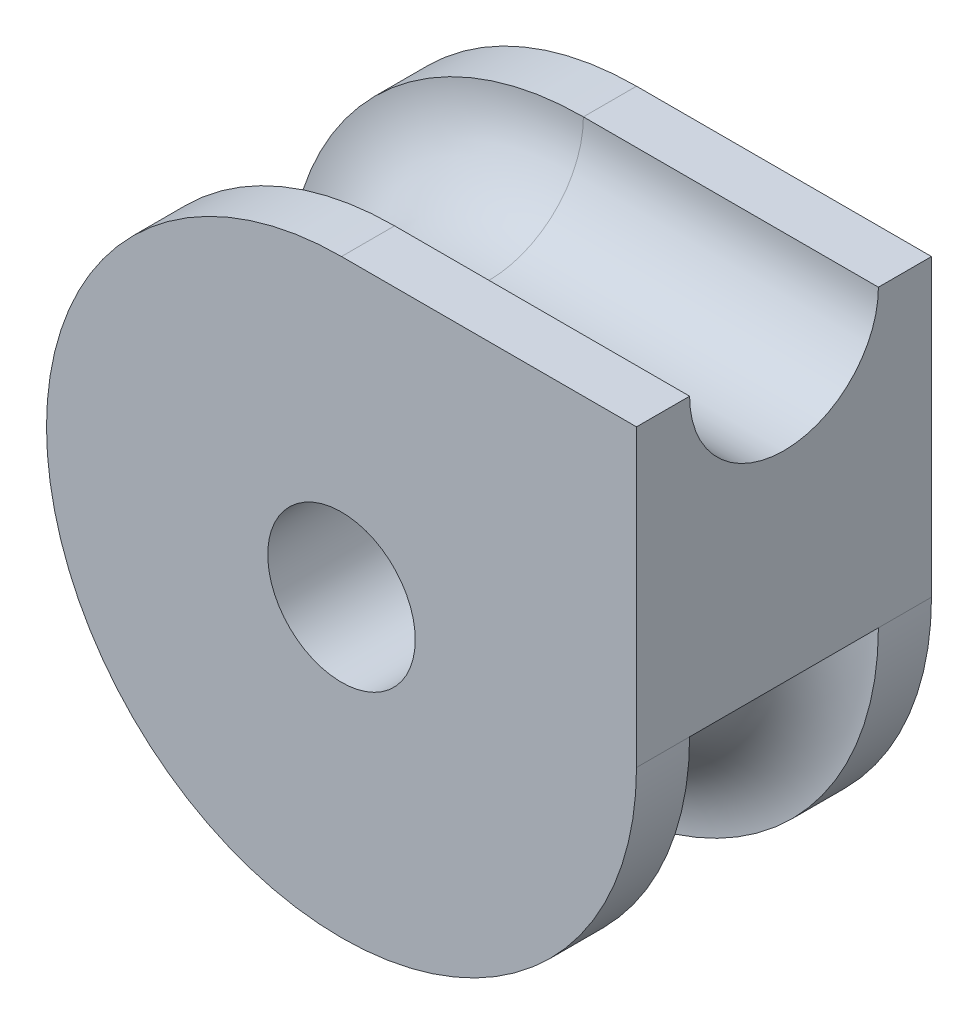
ISO-10303-21;
HEADER;
FILE_DESCRIPTION(('STEP AP214'),'2;1');
FILE_NAME('part.step','',(''),(''),'','','');
FILE_SCHEMA(('AUTOMOTIVE_DESIGN { 1 0 10303 214 1 1 1 1 }'));
ENDSEC;
DATA;
#1=APPLICATION_CONTEXT('core data for automotive mechanical design processes');
#2=APPLICATION_PROTOCOL_DEFINITION('international standard','automotive_design',2000,#1);
#3=PRODUCT_CONTEXT('',#1,'mechanical');
#4=PRODUCT('Part','Part','',(#3));
#5=PRODUCT_RELATED_PRODUCT_CATEGORY('part','',(#4));
#6=PRODUCT_DEFINITION_FORMATION('','',#4);
#7=PRODUCT_DEFINITION_CONTEXT('part definition',#1,'design');
#8=PRODUCT_DEFINITION('design','',#6,#7);
#9=PRODUCT_DEFINITION_SHAPE('','',#8);
#10=(LENGTH_UNIT() NAMED_UNIT(*) SI_UNIT(.MILLI.,.METRE.));
#11=(NAMED_UNIT(*) PLANE_ANGLE_UNIT() SI_UNIT($,.RADIAN.));
#12=(NAMED_UNIT(*) SI_UNIT($,.STERADIAN.) SOLID_ANGLE_UNIT());
#13=UNCERTAINTY_MEASURE_WITH_UNIT(LENGTH_MEASURE(1.E-05),#10,'distance_accuracy_value','');
#14=(GEOMETRIC_REPRESENTATION_CONTEXT(3) GLOBAL_UNCERTAINTY_ASSIGNED_CONTEXT((#13)) GLOBAL_UNIT_ASSIGNED_CONTEXT((#10,
#11,#12)) REPRESENTATION_CONTEXT('',''));
#15=CARTESIAN_POINT('',(0.,0.,0.));
#16=DIRECTION('',(0.,0.,1.));
#17=DIRECTION('',(1.,0.,0.));
#18=AXIS2_PLACEMENT_3D('',#15,#16,#17);
#19=CARTESIAN_POINT('',(0.,50.,50.));
#20=DIRECTION('',(0.,-1.,0.));
#21=DIRECTION('',(0.,0.,-1.));
#22=AXIS2_PLACEMENT_3D('',#19,#20,#21);
#23=PLANE('',#22);
#24=DIRECTION('',(-1.,0.,0.));
#25=VECTOR('',#24,1.);
#26=CARTESIAN_POINT('',(50.,50.,9.));
#27=LINE('',#26,#25);
#28=CARTESIAN_POINT('',(50.,50.,9.));
#29=VERTEX_POINT('',#28);
#30=CARTESIAN_POINT('',(0.,50.,9.));
#31=VERTEX_POINT('',#30);
#32=EDGE_CURVE('E111',#29,#31,#27,.T.);
#33=ORIENTED_EDGE('',*,*,#32,.F.);
#34=DIRECTION('',(0.,0.,-1.));
#35=VECTOR('',#34,1.);
#36=CARTESIAN_POINT('',(50.,50.,50.));
#37=LINE('',#36,#35);
#38=CARTESIAN_POINT('',(50.,50.,0.));
#39=VERTEX_POINT('',#38);
#40=EDGE_CURVE('E118',#29,#39,#37,.T.);
#41=ORIENTED_EDGE('',*,*,#40,.T.);
#42=DIRECTION('',(-1.,0.,0.));
#43=VECTOR('',#42,1.);
#44=CARTESIAN_POINT('',(0.,50.,0.));
#45=LINE('',#44,#43);
#46=CARTESIAN_POINT('',(0.,50.,0.));
#47=VERTEX_POINT('',#46);
#48=EDGE_CURVE('E135',#39,#47,#45,.T.);
#49=ORIENTED_EDGE('',*,*,#48,.T.);
#50=DIRECTION('',(0.,0.,-1.));
#51=VECTOR('',#50,1.);
#52=CARTESIAN_POINT('',(0.,50.,50.));
#53=LINE('',#52,#51);
#54=EDGE_CURVE('E87',#31,#47,#53,.T.);
#55=ORIENTED_EDGE('',*,*,#54,.F.);
#56=EDGE_LOOP('',(#33,#41,#49,#55));
#57=FACE_BOUND('',#56,.T.);
#58=ADVANCED_FACE('F42',(#57),#23,.F.);
#59=CARTESIAN_POINT('',(0.,0.,50.));
#60=DIRECTION('',(0.,0.,-1.));
#61=DIRECTION('',(-1.,0.,0.));
#62=AXIS2_PLACEMENT_3D('',#59,#60,#61);
#63=CYLINDRICAL_SURFACE('',#62,50.);
#64=DIRECTION('',(0.,0.,-1.));
#65=VECTOR('',#64,1.);
#66=CARTESIAN_POINT('',(50.,0.,50.));
#67=LINE('',#66,#65);
#68=CARTESIAN_POINT('',(50.,5.2372220082647E-13,9.));
#69=VERTEX_POINT('',#68);
#70=CARTESIAN_POINT('',(50.,0.,0.));
#71=VERTEX_POINT('',#70);
#72=EDGE_CURVE('E52',#69,#71,#67,.T.);
#73=ORIENTED_EDGE('',*,*,#72,.F.);
#74=CARTESIAN_POINT('',(0.,0.,9.));
#75=DIRECTION('',(0.,0.,-1.));
#76=DIRECTION('',(-1.,0.,0.));
#77=AXIS2_PLACEMENT_3D('',#74,#75,#76);
#78=CIRCLE('',#77,50.);
#79=EDGE_CURVE('E153',#69,#31,#78,.T.);
#80=ORIENTED_EDGE('',*,*,#79,.T.);
#81=ORIENTED_EDGE('',*,*,#54,.T.);
#82=CARTESIAN_POINT('',(0.,0.,0.));
#83=DIRECTION('',(0.,0.,1.));
#84=DIRECTION('',(1.,0.,0.));
#85=AXIS2_PLACEMENT_3D('',#82,#83,#84);
#86=CIRCLE('',#85,50.);
#87=EDGE_CURVE('E138',#47,#71,#86,.T.);
#88=ORIENTED_EDGE('',*,*,#87,.T.);
#89=EDGE_LOOP('',(#73,#80,#81,#88));
#90=FACE_BOUND('',#89,.T.);
#91=ADVANCED_FACE('F177',(#90),#63,.T.);
#92=CARTESIAN_POINT('',(0.,0.,50.));
#93=DIRECTION('',(0.,0.,1.));
#94=DIRECTION('',(1.,0.,0.));
#95=AXIS2_PLACEMENT_3D('',#92,#93,#94);
#96=PLANE('',#95);
#97=CARTESIAN_POINT('',(0.,0.,50.));
#98=DIRECTION('',(0.,0.,1.));
#99=DIRECTION('',(1.,0.,0.));
#100=AXIS2_PLACEMENT_3D('',#97,#98,#99);
#101=CIRCLE('',#100,50.);
#102=CARTESIAN_POINT('',(0.,50.,50.));
#103=VERTEX_POINT('',#102);
#104=CARTESIAN_POINT('',(50.,0.,50.));
#105=VERTEX_POINT('',#104);
#106=EDGE_CURVE('E133',#103,#105,#101,.T.);
#107=ORIENTED_EDGE('',*,*,#106,.T.);
#108=DIRECTION('',(0.,1.,0.));
#109=VECTOR('',#108,1.);
#110=CARTESIAN_POINT('',(50.,50.,50.));
#111=LINE('',#110,#109);
#112=CARTESIAN_POINT('',(50.,50.,50.));
#113=VERTEX_POINT('',#112);
#114=EDGE_CURVE('E95',#105,#113,#111,.T.);
#115=ORIENTED_EDGE('',*,*,#114,.T.);
#116=DIRECTION('',(-1.,0.,0.));
#117=VECTOR('',#116,1.);
#118=CARTESIAN_POINT('',(0.,50.,50.));
#119=LINE('',#118,#117);
#120=EDGE_CURVE('E68',#113,#103,#119,.T.);
#121=ORIENTED_EDGE('',*,*,#120,.T.);
#122=EDGE_LOOP('',(#107,#115,#121));
#123=FACE_BOUND('',#122,.T.);
#124=CARTESIAN_POINT('',(0.,0.,50.));
#125=DIRECTION('',(0.,0.,1.));
#126=DIRECTION('',(1.,0.,0.));
#127=AXIS2_PLACEMENT_3D('',#124,#125,#126);
#128=CIRCLE('',#127,12.5);
#129=CARTESIAN_POINT('',(12.5,0.,50.));
#130=VERTEX_POINT('',#129);
#131=EDGE_CURVE('E142',#130,#130,#128,.T.);
#132=ORIENTED_EDGE('',*,*,#131,.F.);
#133=EDGE_LOOP('',(#132));
#134=FACE_BOUND('',#133,.T.);
#135=ADVANCED_FACE('F195',(#123,#134),#96,.T.);
#136=CARTESIAN_POINT('',(0.,0.,0.));
#137=DIRECTION('',(0.,0.,1.));
#138=DIRECTION('',(1.,0.,0.));
#139=AXIS2_PLACEMENT_3D('',#136,#137,#138);
#140=PLANE('',#139);
#141=ORIENTED_EDGE('',*,*,#87,.F.);
#142=ORIENTED_EDGE('',*,*,#48,.F.);
#143=DIRECTION('',(0.,1.,0.));
#144=VECTOR('',#143,1.);
#145=CARTESIAN_POINT('',(50.,50.,0.));
#146=LINE('',#145,#144);
#147=EDGE_CURVE('E136',#71,#39,#146,.T.);
#148=ORIENTED_EDGE('',*,*,#147,.F.);
#149=EDGE_LOOP('',(#141,#142,#148));
#150=FACE_BOUND('',#149,.T.);
#151=CARTESIAN_POINT('',(0.,0.,0.));
#152=DIRECTION('',(0.,0.,1.));
#153=DIRECTION('',(1.,0.,0.));
#154=AXIS2_PLACEMENT_3D('',#151,#152,#153);
#155=CIRCLE('',#154,12.5);
#156=CARTESIAN_POINT('',(12.5,0.,0.));
#157=VERTEX_POINT('',#156);
#158=EDGE_CURVE('E149',#157,#157,#155,.T.);
#159=ORIENTED_EDGE('',*,*,#158,.T.);
#160=EDGE_LOOP('',(#159));
#161=FACE_BOUND('',#160,.T.);
#162=ADVANCED_FACE('F183',(#150,#161),#140,.F.);
#163=CARTESIAN_POINT('',(0.,50.,41.));
#164=VERTEX_POINT('',#163);
#165=EDGE_CURVE('E130',#103,#164,#53,.T.);
#166=ORIENTED_EDGE('',*,*,#165,.T.);
#167=CARTESIAN_POINT('',(0.,0.,41.));
#168=DIRECTION('',(0.,0.,-1.));
#169=DIRECTION('',(-1.,0.,0.));
#170=AXIS2_PLACEMENT_3D('',#167,#168,#169);
#171=CIRCLE('',#170,50.);
#172=CARTESIAN_POINT('',(50.,5.2372220082647E-13,41.));
#173=VERTEX_POINT('',#172);
#174=EDGE_CURVE('E157',#173,#164,#171,.T.);
#175=ORIENTED_EDGE('',*,*,#174,.F.);
#176=EDGE_CURVE('E11',#105,#173,#67,.T.);
#177=ORIENTED_EDGE('',*,*,#176,.F.);
#178=ORIENTED_EDGE('',*,*,#106,.F.);
#179=EDGE_LOOP('',(#166,#175,#177,#178));
#180=FACE_BOUND('',#179,.T.);
#181=ADVANCED_FACE('F46',(#180),#63,.T.);
#182=CARTESIAN_POINT('',(50.,50.,50.));
#183=DIRECTION('',(-1.,0.,0.));
#184=DIRECTION('',(0.,0.,1.));
#185=AXIS2_PLACEMENT_3D('',#182,#183,#184);
#186=PLANE('',#185);
#187=CARTESIAN_POINT('',(50.,50.,25.));
#188=DIRECTION('',(1.,0.,0.));
#189=DIRECTION('',(0.,0.,-1.));
#190=AXIS2_PLACEMENT_3D('',#187,#188,#189);
#191=CIRCLE('',#190,16.);
#192=CARTESIAN_POINT('',(50.,50.,41.));
#193=VERTEX_POINT('',#192);
#194=EDGE_CURVE('E58',#193,#29,#191,.T.);
#195=ORIENTED_EDGE('',*,*,#194,.F.);
#196=EDGE_CURVE('E119',#113,#193,#37,.T.);
#197=ORIENTED_EDGE('',*,*,#196,.F.);
#198=ORIENTED_EDGE('',*,*,#114,.F.);
#199=ORIENTED_EDGE('',*,*,#176,.T.);
#200=DIRECTION('',(0.,0.,1.));
#201=VECTOR('',#200,1.);
#202=CARTESIAN_POINT('',(50.,5.2372220082647E-13,41.));
#203=LINE('',#202,#201);
#204=EDGE_CURVE('E165',#69,#173,#203,.T.);
#205=ORIENTED_EDGE('',*,*,#204,.F.);
#206=ORIENTED_EDGE('',*,*,#72,.T.);
#207=ORIENTED_EDGE('',*,*,#147,.T.);
#208=ORIENTED_EDGE('',*,*,#40,.F.);
#209=EDGE_LOOP('',(#195,#197,#198,#199,#205,#206,#207,#208));
#210=FACE_BOUND('',#209,.T.);
#211=ADVANCED_FACE('F120',(#210),#186,.F.);
#212=ORIENTED_EDGE('',*,*,#196,.T.);
#213=DIRECTION('',(-1.,0.,0.));
#214=VECTOR('',#213,1.);
#215=CARTESIAN_POINT('',(50.,50.,41.));
#216=LINE('',#215,#214);
#217=EDGE_CURVE('E106',#193,#164,#216,.T.);
#218=ORIENTED_EDGE('',*,*,#217,.T.);
#219=ORIENTED_EDGE('',*,*,#165,.F.);
#220=ORIENTED_EDGE('',*,*,#120,.F.);
#221=EDGE_LOOP('',(#212,#218,#219,#220));
#222=FACE_BOUND('',#221,.T.);
#223=ADVANCED_FACE('F122',(#222),#23,.F.);
#224=CARTESIAN_POINT('',(0.,0.,50.));
#225=DIRECTION('',(0.,0.,-1.));
#226=DIRECTION('',(-1.,0.,0.));
#227=AXIS2_PLACEMENT_3D('',#224,#225,#226);
#228=CYLINDRICAL_SURFACE('',#227,12.5);
#229=ORIENTED_EDGE('',*,*,#131,.T.);
#230=EDGE_LOOP('',(#229));
#231=FACE_BOUND('',#230,.T.);
#232=ORIENTED_EDGE('',*,*,#158,.F.);
#233=EDGE_LOOP('',(#232));
#234=FACE_BOUND('',#233,.T.);
#235=ADVANCED_FACE('F196',(#231,#234),#228,.F.);
#236=CARTESIAN_POINT('',(0.,0.,25.));
#237=DIRECTION('',(0.,0.,-1.));
#238=DIRECTION('',(-1.,0.,0.));
#239=AXIS2_PLACEMENT_3D('',#236,#237,#238);
#240=TOROIDAL_SURFACE('',#239,50.,16.);
#241=ORIENTED_EDGE('',*,*,#79,.F.);
#242=CARTESIAN_POINT('',(50.,5.2372220082647E-13,25.));
#243=DIRECTION('',(0.,-1.,0.));
#244=DIRECTION('',(0.,0.,-1.));
#245=AXIS2_PLACEMENT_3D('',#242,#243,#244);
#246=CIRCLE('',#245,16.);
#247=EDGE_CURVE('E167',#173,#69,#246,.T.);
#248=ORIENTED_EDGE('',*,*,#247,.F.);
#249=ORIENTED_EDGE('',*,*,#174,.T.);
#250=CARTESIAN_POINT('',(0.,50.,25.));
#251=DIRECTION('',(1.,0.,0.));
#252=DIRECTION('',(0.,0.,-1.));
#253=AXIS2_PLACEMENT_3D('',#250,#251,#252);
#254=CIRCLE('',#253,16.);
#255=EDGE_CURVE('E108',#164,#31,#254,.T.);
#256=ORIENTED_EDGE('',*,*,#255,.T.);
#257=EDGE_LOOP('',(#241,#248,#249,#256));
#258=FACE_BOUND('',#257,.T.);
#259=ADVANCED_FACE('F173',(#258),#240,.F.);
#260=CARTESIAN_POINT('',(50.,5.2372220082647E-13,25.));
#261=DIRECTION('',(0.,-1.,0.));
#262=DIRECTION('',(0.,0.,-1.));
#263=AXIS2_PLACEMENT_3D('',#260,#261,#262);
#264=PLANE('',#263);
#265=ORIENTED_EDGE('',*,*,#247,.T.);
#266=ORIENTED_EDGE('',*,*,#204,.T.);
#267=EDGE_LOOP('',(#265,#266));
#268=FACE_BOUND('',#267,.T.);
#269=ADVANCED_FACE('F186',(#268),#264,.T.);
#270=CARTESIAN_POINT('',(50.,50.,25.));
#271=DIRECTION('',(-1.,0.,0.));
#272=DIRECTION('',(0.,0.,1.));
#273=AXIS2_PLACEMENT_3D('',#270,#271,#272);
#274=CYLINDRICAL_SURFACE('',#273,16.);
#275=ORIENTED_EDGE('',*,*,#255,.F.);
#276=ORIENTED_EDGE('',*,*,#217,.F.);
#277=ORIENTED_EDGE('',*,*,#194,.T.);
#278=ORIENTED_EDGE('',*,*,#32,.T.);
#279=EDGE_LOOP('',(#275,#276,#277,#278));
#280=FACE_BOUND('',#279,.T.);
#281=ADVANCED_FACE('F110',(#280),#274,.F.);
#282=CLOSED_SHELL('',(#58,#91,#135,#162,#181,#211,#223,#235,#259,#269,#281));
#283=MANIFOLD_SOLID_BREP('B2',#282);
#284=ADVANCED_BREP_SHAPE_REPRESENTATION('',(#18,#283),#14);
#285=SHAPE_DEFINITION_REPRESENTATION(#9,#284);
ENDSEC;
END-ISO-10303-21;
